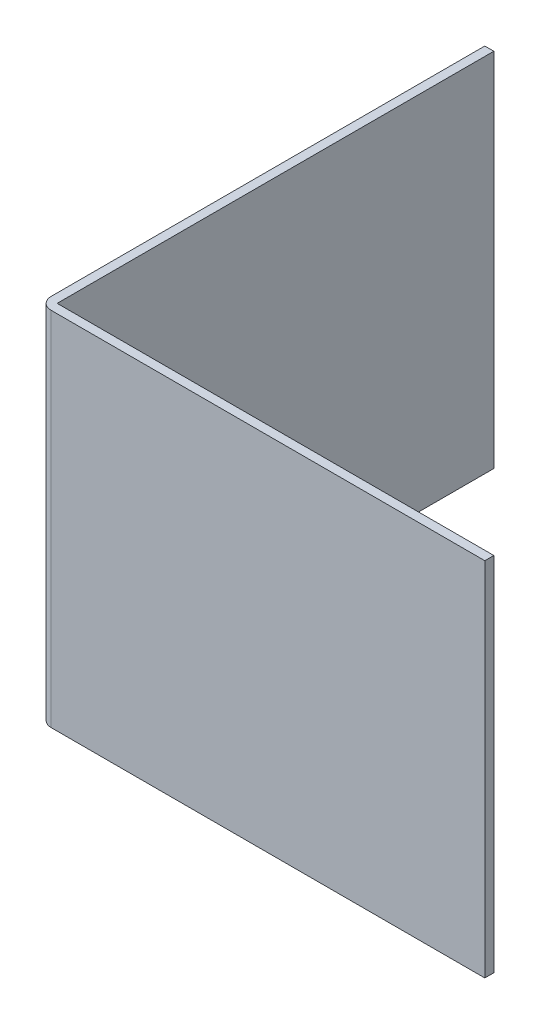
ISO-10303-21;
HEADER;
FILE_DESCRIPTION(('STEP AP214'),'2;1');
FILE_NAME('part.step','',(''),(''),'','','');
FILE_SCHEMA(('AUTOMOTIVE_DESIGN { 1 0 10303 214 1 1 1 1 }'));
ENDSEC;
DATA;
#1=APPLICATION_CONTEXT('core data for automotive mechanical design processes');
#2=APPLICATION_PROTOCOL_DEFINITION('international standard','automotive_design',2000,#1);
#3=PRODUCT_CONTEXT('',#1,'mechanical');
#4=PRODUCT('Part','Part','',(#3));
#5=PRODUCT_RELATED_PRODUCT_CATEGORY('part','',(#4));
#6=PRODUCT_DEFINITION_FORMATION('','',#4);
#7=PRODUCT_DEFINITION_CONTEXT('part definition',#1,'design');
#8=PRODUCT_DEFINITION('design','',#6,#7);
#9=PRODUCT_DEFINITION_SHAPE('','',#8);
#10=(LENGTH_UNIT() NAMED_UNIT(*) SI_UNIT(.MILLI.,.METRE.));
#11=(NAMED_UNIT(*) PLANE_ANGLE_UNIT() SI_UNIT($,.RADIAN.));
#12=(NAMED_UNIT(*) SI_UNIT($,.STERADIAN.) SOLID_ANGLE_UNIT());
#13=UNCERTAINTY_MEASURE_WITH_UNIT(LENGTH_MEASURE(1.E-05),#10,'distance_accuracy_value','');
#14=(GEOMETRIC_REPRESENTATION_CONTEXT(3) GLOBAL_UNCERTAINTY_ASSIGNED_CONTEXT((#13)) GLOBAL_UNIT_ASSIGNED_CONTEXT((#10,
#11,#12)) REPRESENTATION_CONTEXT('',''));
#15=CARTESIAN_POINT('',(0.,0.,0.));
#16=DIRECTION('',(0.,0.,1.));
#17=DIRECTION('',(1.,0.,0.));
#18=AXIS2_PLACEMENT_3D('',#15,#16,#17);
#19=CARTESIAN_POINT('',(145.,120.,3.));
#20=DIRECTION('',(-1.,0.,0.));
#21=DIRECTION('',(0.,0.,1.));
#22=AXIS2_PLACEMENT_3D('',#19,#20,#21);
#23=PLANE('',#22);
#24=DIRECTION('',(0.,0.,-1.));
#25=VECTOR('',#24,1.);
#26=CARTESIAN_POINT('',(145.,0.,3.));
#27=LINE('',#26,#25);
#28=CARTESIAN_POINT('',(145.,0.,3.));
#29=VERTEX_POINT('',#28);
#30=CARTESIAN_POINT('',(145.,0.,0.));
#31=VERTEX_POINT('',#30);
#32=EDGE_CURVE('E130',#29,#31,#27,.T.);
#33=ORIENTED_EDGE('',*,*,#32,.T.);
#34=DIRECTION('',(0.,-1.,0.));
#35=VECTOR('',#34,1.);
#36=CARTESIAN_POINT('',(145.,120.,0.));
#37=LINE('',#36,#35);
#38=CARTESIAN_POINT('',(145.,120.,0.));
#39=VERTEX_POINT('',#38);
#40=EDGE_CURVE('E109',#39,#31,#37,.T.);
#41=ORIENTED_EDGE('',*,*,#40,.F.);
#42=DIRECTION('',(0.,0.,-1.));
#43=VECTOR('',#42,1.);
#44=CARTESIAN_POINT('',(145.,120.,3.));
#45=LINE('',#44,#43);
#46=CARTESIAN_POINT('',(145.,120.,3.));
#47=VERTEX_POINT('',#46);
#48=EDGE_CURVE('E117',#47,#39,#45,.T.);
#49=ORIENTED_EDGE('',*,*,#48,.F.);
#50=DIRECTION('',(0.,-1.,0.));
#51=VECTOR('',#50,1.);
#52=CARTESIAN_POINT('',(145.,120.,3.));
#53=LINE('',#52,#51);
#54=EDGE_CURVE('E151',#47,#29,#53,.T.);
#55=ORIENTED_EDGE('',*,*,#54,.T.);
#56=EDGE_LOOP('',(#33,#41,#49,#55));
#57=FACE_BOUND('',#56,.T.);
#58=ADVANCED_FACE('F45',(#57),#23,.F.);
#59=CARTESIAN_POINT('',(145.,120.,0.));
#60=DIRECTION('',(0.,0.,1.));
#61=DIRECTION('',(1.,0.,0.));
#62=AXIS2_PLACEMENT_3D('',#59,#60,#61);
#63=PLANE('',#62);
#64=DIRECTION('',(-1.,0.,0.));
#65=VECTOR('',#64,1.);
#66=CARTESIAN_POINT('',(145.,0.,0.));
#67=LINE('',#66,#65);
#68=CARTESIAN_POINT('',(0.,0.,0.));
#69=VERTEX_POINT('',#68);
#70=EDGE_CURVE('E165',#31,#69,#67,.T.);
#71=ORIENTED_EDGE('',*,*,#70,.T.);
#72=DIRECTION('',(0.,-1.,0.));
#73=VECTOR('',#72,1.);
#74=CARTESIAN_POINT('',(0.,120.,0.));
#75=LINE('',#74,#73);
#76=CARTESIAN_POINT('',(0.,120.,0.));
#77=VERTEX_POINT('',#76);
#78=EDGE_CURVE('E112',#77,#69,#75,.T.);
#79=ORIENTED_EDGE('',*,*,#78,.F.);
#80=DIRECTION('',(-1.,0.,0.));
#81=VECTOR('',#80,1.);
#82=CARTESIAN_POINT('',(145.,120.,0.));
#83=LINE('',#82,#81);
#84=EDGE_CURVE('E105',#39,#77,#83,.T.);
#85=ORIENTED_EDGE('',*,*,#84,.F.);
#86=ORIENTED_EDGE('',*,*,#40,.T.);
#87=EDGE_LOOP('',(#71,#79,#85,#86));
#88=FACE_BOUND('',#87,.T.);
#89=ADVANCED_FACE('F107',(#88),#63,.F.);
#90=CARTESIAN_POINT('',(0.,120.,0.));
#91=DIRECTION('',(-1.,0.,0.));
#92=DIRECTION('',(0.,0.,1.));
#93=AXIS2_PLACEMENT_3D('',#90,#91,#92);
#94=PLANE('',#93);
#95=DIRECTION('',(0.,0.,-1.));
#96=VECTOR('',#95,1.);
#97=CARTESIAN_POINT('',(0.,0.,0.));
#98=LINE('',#97,#96);
#99=CARTESIAN_POINT('',(0.,0.,-145.));
#100=VERTEX_POINT('',#99);
#101=EDGE_CURVE('E162',#69,#100,#98,.T.);
#102=ORIENTED_EDGE('',*,*,#101,.T.);
#103=DIRECTION('',(0.,-1.,0.));
#104=VECTOR('',#103,1.);
#105=CARTESIAN_POINT('',(0.,120.,-145.));
#106=LINE('',#105,#104);
#107=CARTESIAN_POINT('',(0.,120.,-145.));
#108=VERTEX_POINT('',#107);
#109=EDGE_CURVE('E138',#108,#100,#106,.T.);
#110=ORIENTED_EDGE('',*,*,#109,.F.);
#111=DIRECTION('',(0.,0.,-1.));
#112=VECTOR('',#111,1.);
#113=CARTESIAN_POINT('',(0.,120.,0.));
#114=LINE('',#113,#112);
#115=EDGE_CURVE('E116',#77,#108,#114,.T.);
#116=ORIENTED_EDGE('',*,*,#115,.F.);
#117=ORIENTED_EDGE('',*,*,#78,.T.);
#118=EDGE_LOOP('',(#102,#110,#116,#117));
#119=FACE_BOUND('',#118,.T.);
#120=ADVANCED_FACE('F183',(#119),#94,.F.);
#121=CARTESIAN_POINT('',(0.,120.,-145.));
#122=DIRECTION('',(0.,0.,1.));
#123=DIRECTION('',(1.,0.,0.));
#124=AXIS2_PLACEMENT_3D('',#121,#122,#123);
#125=PLANE('',#124);
#126=DIRECTION('',(-1.,0.,0.));
#127=VECTOR('',#126,1.);
#128=CARTESIAN_POINT('',(0.,0.,-145.));
#129=LINE('',#128,#127);
#130=CARTESIAN_POINT('',(-3.,0.,-145.));
#131=VERTEX_POINT('',#130);
#132=EDGE_CURVE('E159',#100,#131,#129,.T.);
#133=ORIENTED_EDGE('',*,*,#132,.T.);
#134=DIRECTION('',(0.,-1.,0.));
#135=VECTOR('',#134,1.);
#136=CARTESIAN_POINT('',(-3.,120.,-145.));
#137=LINE('',#136,#135);
#138=CARTESIAN_POINT('',(-3.,120.,-145.));
#139=VERTEX_POINT('',#138);
#140=EDGE_CURVE('E147',#139,#131,#137,.T.);
#141=ORIENTED_EDGE('',*,*,#140,.F.);
#142=DIRECTION('',(-1.,0.,0.));
#143=VECTOR('',#142,1.);
#144=CARTESIAN_POINT('',(0.,120.,-145.));
#145=LINE('',#144,#143);
#146=EDGE_CURVE('E175',#108,#139,#145,.T.);
#147=ORIENTED_EDGE('',*,*,#146,.F.);
#148=ORIENTED_EDGE('',*,*,#109,.T.);
#149=EDGE_LOOP('',(#133,#141,#147,#148));
#150=FACE_BOUND('',#149,.T.);
#151=ADVANCED_FACE('F187',(#150),#125,.F.);
#152=CARTESIAN_POINT('',(-3.,120.,-145.));
#153=DIRECTION('',(1.,0.,0.));
#154=DIRECTION('',(0.,0.,-1.));
#155=AXIS2_PLACEMENT_3D('',#152,#153,#154);
#156=PLANE('',#155);
#157=DIRECTION('',(0.,0.,1.));
#158=VECTOR('',#157,1.);
#159=CARTESIAN_POINT('',(-3.,0.,-145.));
#160=LINE('',#159,#158);
#161=CARTESIAN_POINT('',(-2.99999999999998,0.,-1.));
#162=VERTEX_POINT('',#161);
#163=EDGE_CURVE('E156',#131,#162,#160,.T.);
#164=ORIENTED_EDGE('',*,*,#163,.T.);
#165=DIRECTION('',(0.,-1.,0.));
#166=VECTOR('',#165,1.);
#167=CARTESIAN_POINT('',(-2.99999999999998,120.,-1.));
#168=LINE('',#167,#166);
#169=CARTESIAN_POINT('',(-2.99999999999998,120.,-1.));
#170=VERTEX_POINT('',#169);
#171=EDGE_CURVE('E54',#162,#170,#168,.F.);
#172=ORIENTED_EDGE('',*,*,#171,.T.);
#173=DIRECTION('',(0.,0.,1.));
#174=VECTOR('',#173,1.);
#175=CARTESIAN_POINT('',(-3.,120.,-145.));
#176=LINE('',#175,#174);
#177=EDGE_CURVE('E172',#139,#170,#176,.T.);
#178=ORIENTED_EDGE('',*,*,#177,.F.);
#179=ORIENTED_EDGE('',*,*,#140,.T.);
#180=EDGE_LOOP('',(#164,#172,#178,#179));
#181=FACE_BOUND('',#180,.T.);
#182=ADVANCED_FACE('F188',(#181),#156,.F.);
#183=CARTESIAN_POINT('',(-2.99999999999998,120.,3.));
#184=DIRECTION('',(0.,0.,-1.));
#185=DIRECTION('',(-1.,0.,0.));
#186=AXIS2_PLACEMENT_3D('',#183,#184,#185);
#187=PLANE('',#186);
#188=DIRECTION('',(1.,0.,0.));
#189=VECTOR('',#188,1.);
#190=CARTESIAN_POINT('',(-2.99999999999998,120.,3.));
#191=LINE('',#190,#189);
#192=CARTESIAN_POINT('',(1.00000000000002,120.,3.));
#193=VERTEX_POINT('',#192);
#194=EDGE_CURVE('E122',#193,#47,#191,.T.);
#195=ORIENTED_EDGE('',*,*,#194,.F.);
#196=DIRECTION('',(0.,-1.,0.));
#197=VECTOR('',#196,1.);
#198=CARTESIAN_POINT('',(1.00000000000002,120.,3.));
#199=LINE('',#198,#197);
#200=CARTESIAN_POINT('',(1.00000000000002,0.,3.));
#201=VERTEX_POINT('',#200);
#202=EDGE_CURVE('E132',#193,#201,#199,.T.);
#203=ORIENTED_EDGE('',*,*,#202,.T.);
#204=DIRECTION('',(1.,0.,0.));
#205=VECTOR('',#204,1.);
#206=CARTESIAN_POINT('',(-2.99999999999998,0.,3.));
#207=LINE('',#206,#205);
#208=EDGE_CURVE('E127',#201,#29,#207,.T.);
#209=ORIENTED_EDGE('',*,*,#208,.T.);
#210=ORIENTED_EDGE('',*,*,#54,.F.);
#211=EDGE_LOOP('',(#195,#203,#209,#210));
#212=FACE_BOUND('',#211,.T.);
#213=ADVANCED_FACE('F193',(#212),#187,.F.);
#214=CARTESIAN_POINT('',(0.,120.,0.));
#215=DIRECTION('',(0.,1.,0.));
#216=DIRECTION('',(0.,0.,1.));
#217=AXIS2_PLACEMENT_3D('',#214,#215,#216);
#218=PLANE('',#217);
#219=ORIENTED_EDGE('',*,*,#177,.T.);
#220=CARTESIAN_POINT('',(1.00000000000002,120.,-1.));
#221=DIRECTION('',(0.,1.,0.));
#222=DIRECTION('',(0.,0.,1.));
#223=AXIS2_PLACEMENT_3D('',#220,#221,#222);
#224=CIRCLE('',#223,4.);
#225=EDGE_CURVE('E11',#170,#193,#224,.T.);
#226=ORIENTED_EDGE('',*,*,#225,.T.);
#227=ORIENTED_EDGE('',*,*,#194,.T.);
#228=ORIENTED_EDGE('',*,*,#48,.T.);
#229=ORIENTED_EDGE('',*,*,#84,.T.);
#230=ORIENTED_EDGE('',*,*,#115,.T.);
#231=ORIENTED_EDGE('',*,*,#146,.T.);
#232=EDGE_LOOP('',(#219,#226,#227,#228,#229,#230,#231));
#233=FACE_BOUND('',#232,.T.);
#234=ADVANCED_FACE('F120',(#233),#218,.T.);
#235=CARTESIAN_POINT('',(0.,0.,0.));
#236=DIRECTION('',(0.,1.,0.));
#237=DIRECTION('',(0.,0.,1.));
#238=AXIS2_PLACEMENT_3D('',#235,#236,#237);
#239=PLANE('',#238);
#240=ORIENTED_EDGE('',*,*,#208,.F.);
#241=CARTESIAN_POINT('',(1.00000000000002,0.,-1.));
#242=DIRECTION('',(0.,1.,0.));
#243=DIRECTION('',(0.,0.,1.));
#244=AXIS2_PLACEMENT_3D('',#241,#242,#243);
#245=CIRCLE('',#244,4.);
#246=EDGE_CURVE('E68',#201,#162,#245,.F.);
#247=ORIENTED_EDGE('',*,*,#246,.T.);
#248=ORIENTED_EDGE('',*,*,#163,.F.);
#249=ORIENTED_EDGE('',*,*,#132,.F.);
#250=ORIENTED_EDGE('',*,*,#101,.F.);
#251=ORIENTED_EDGE('',*,*,#70,.F.);
#252=ORIENTED_EDGE('',*,*,#32,.F.);
#253=EDGE_LOOP('',(#240,#247,#248,#249,#250,#251,#252));
#254=FACE_BOUND('',#253,.T.);
#255=ADVANCED_FACE('F194',(#254),#239,.F.);
#256=CARTESIAN_POINT('',(1.00000000000002,120.,-1.));
#257=DIRECTION('',(0.,-1.,0.));
#258=DIRECTION('',(0.,0.,-1.));
#259=AXIS2_PLACEMENT_3D('',#256,#257,#258);
#260=CYLINDRICAL_SURFACE('',#259,4.);
#261=ORIENTED_EDGE('',*,*,#225,.F.);
#262=ORIENTED_EDGE('',*,*,#171,.F.);
#263=ORIENTED_EDGE('',*,*,#246,.F.);
#264=ORIENTED_EDGE('',*,*,#202,.F.);
#265=EDGE_LOOP('',(#261,#262,#263,#264));
#266=FACE_BOUND('',#265,.T.);
#267=ADVANCED_FACE('F47',(#266),#260,.T.);
#268=CLOSED_SHELL('',(#58,#89,#120,#151,#182,#213,#234,#255,#267));
#269=MANIFOLD_SOLID_BREP('B2',#268);
#270=ADVANCED_BREP_SHAPE_REPRESENTATION('',(#18,#269),#14);
#271=SHAPE_DEFINITION_REPRESENTATION(#9,#270);
ENDSEC;
END-ISO-10303-21;
